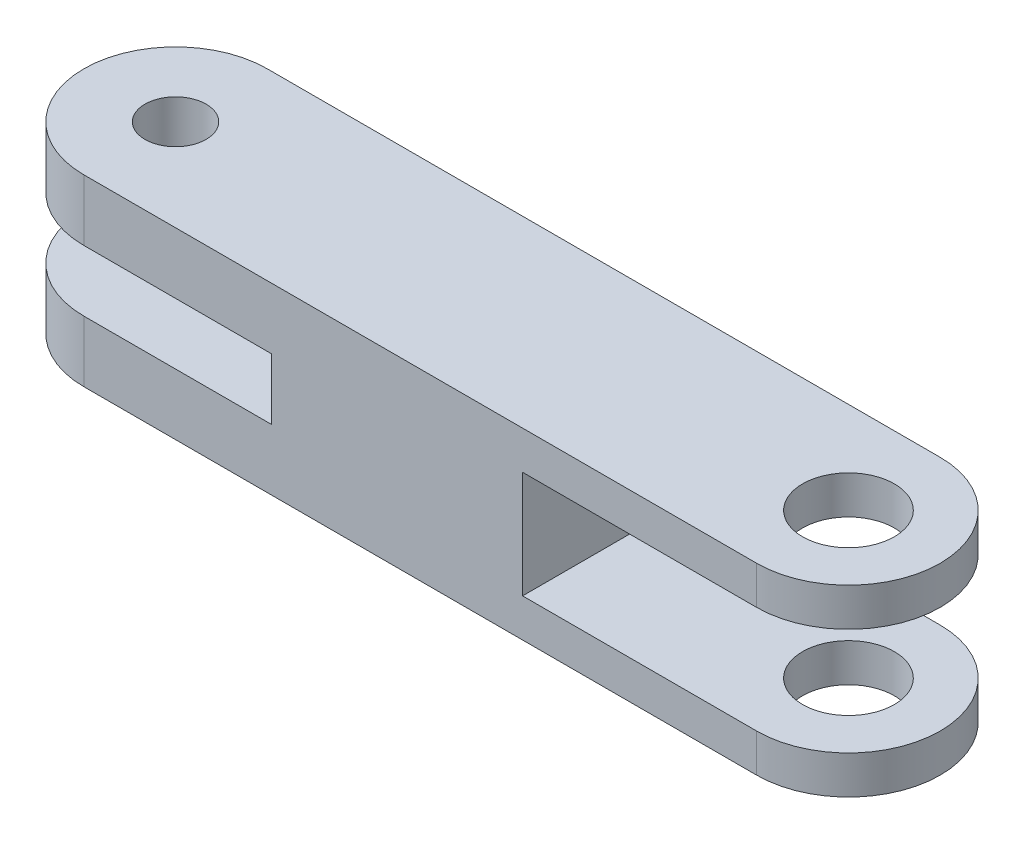
ISO-10303-21;
HEADER;
FILE_DESCRIPTION(('STEP AP214'),'2;1');
FILE_NAME('part.step','',(''),(''),'','','');
FILE_SCHEMA(('AUTOMOTIVE_DESIGN { 1 0 10303 214 1 1 1 1 }'));
ENDSEC;
DATA;
#1=APPLICATION_CONTEXT('core data for automotive mechanical design processes');
#2=APPLICATION_PROTOCOL_DEFINITION('international standard','automotive_design',2000,#1);
#3=PRODUCT_CONTEXT('',#1,'mechanical');
#4=PRODUCT('Part','Part','',(#3));
#5=PRODUCT_RELATED_PRODUCT_CATEGORY('part','',(#4));
#6=PRODUCT_DEFINITION_FORMATION('','',#4);
#7=PRODUCT_DEFINITION_CONTEXT('part definition',#1,'design');
#8=PRODUCT_DEFINITION('design','',#6,#7);
#9=PRODUCT_DEFINITION_SHAPE('','',#8);
#10=(LENGTH_UNIT() NAMED_UNIT(*) SI_UNIT(.MILLI.,.METRE.));
#11=(NAMED_UNIT(*) PLANE_ANGLE_UNIT() SI_UNIT($,.RADIAN.));
#12=(NAMED_UNIT(*) SI_UNIT($,.STERADIAN.) SOLID_ANGLE_UNIT());
#13=UNCERTAINTY_MEASURE_WITH_UNIT(LENGTH_MEASURE(1.E-05),#10,'distance_accuracy_value','');
#14=(GEOMETRIC_REPRESENTATION_CONTEXT(3) GLOBAL_UNCERTAINTY_ASSIGNED_CONTEXT((#13)) GLOBAL_UNIT_ASSIGNED_CONTEXT((#10,
#11,#12)) REPRESENTATION_CONTEXT('',''));
#15=CARTESIAN_POINT('',(0.,0.,0.));
#16=DIRECTION('',(0.,0.,1.));
#17=DIRECTION('',(1.,0.,0.));
#18=AXIS2_PLACEMENT_3D('',#15,#16,#17);
#19=CARTESIAN_POINT('',(0.,3.,0.));
#20=DIRECTION('',(0.,-1.,0.));
#21=DIRECTION('',(0.,0.,-1.));
#22=AXIS2_PLACEMENT_3D('',#19,#20,#21);
#23=CYLINDRICAL_SURFACE('',#22,3.);
#24=CARTESIAN_POINT('',(0.,1.,0.));
#25=DIRECTION('',(0.,-1.,0.));
#26=DIRECTION('',(0.,0.,-1.));
#27=AXIS2_PLACEMENT_3D('',#24,#25,#26);
#28=CIRCLE('',#27,3.);
#29=CARTESIAN_POINT('',(0.,1.,3.));
#30=VERTEX_POINT('',#29);
#31=CARTESIAN_POINT('',(0.,1.,-3.));
#32=VERTEX_POINT('',#31);
#33=EDGE_CURVE('E153',#30,#32,#28,.T.);
#34=ORIENTED_EDGE('',*,*,#33,.F.);
#35=DIRECTION('',(0.,-1.,0.));
#36=VECTOR('',#35,1.);
#37=CARTESIAN_POINT('',(0.,3.,3.));
#38=LINE('',#37,#36);
#39=CARTESIAN_POINT('',(0.,3.,3.));
#40=VERTEX_POINT('',#39);
#41=EDGE_CURVE('E148',#40,#30,#38,.T.);
#42=ORIENTED_EDGE('',*,*,#41,.F.);
#43=CARTESIAN_POINT('',(0.,3.,0.));
#44=DIRECTION('',(0.,1.,0.));
#45=DIRECTION('',(0.,0.,1.));
#46=AXIS2_PLACEMENT_3D('',#43,#44,#45);
#47=CIRCLE('',#46,3.);
#48=CARTESIAN_POINT('',(0.,3.,-3.));
#49=VERTEX_POINT('',#48);
#50=EDGE_CURVE('E200',#49,#40,#47,.T.);
#51=ORIENTED_EDGE('',*,*,#50,.F.);
#52=DIRECTION('',(0.,-1.,0.));
#53=VECTOR('',#52,1.);
#54=CARTESIAN_POINT('',(0.,3.,-3.));
#55=LINE('',#54,#53);
#56=EDGE_CURVE('E221',#49,#32,#55,.T.);
#57=ORIENTED_EDGE('',*,*,#56,.T.);
#58=EDGE_LOOP('',(#34,#42,#51,#57));
#59=FACE_BOUND('',#58,.T.);
#60=ADVANCED_FACE('F41',(#59),#23,.T.);
#61=CARTESIAN_POINT('',(0.,3.,0.));
#62=DIRECTION('',(0.,-1.,0.));
#63=DIRECTION('',(0.,0.,-1.));
#64=AXIS2_PLACEMENT_3D('',#61,#62,#63);
#65=CYLINDRICAL_SURFACE('',#64,1.);
#66=CARTESIAN_POINT('',(0.,3.,0.));
#67=DIRECTION('',(0.,1.,0.));
#68=DIRECTION('',(0.,0.,1.));
#69=AXIS2_PLACEMENT_3D('',#66,#67,#68);
#70=CIRCLE('',#69,1.);
#71=CARTESIAN_POINT('',(0.,3.,1.));
#72=VERTEX_POINT('',#71);
#73=EDGE_CURVE('E188',#72,#72,#70,.T.);
#74=ORIENTED_EDGE('',*,*,#73,.T.);
#75=EDGE_LOOP('',(#74));
#76=FACE_BOUND('',#75,.T.);
#77=CARTESIAN_POINT('',(0.,1.,0.));
#78=DIRECTION('',(0.,-1.,0.));
#79=DIRECTION('',(0.,0.,-1.));
#80=AXIS2_PLACEMENT_3D('',#77,#78,#79);
#81=CIRCLE('',#80,1.);
#82=CARTESIAN_POINT('',(0.,1.,-1.));
#83=VERTEX_POINT('',#82);
#84=EDGE_CURVE('E240',#83,#83,#81,.T.);
#85=ORIENTED_EDGE('',*,*,#84,.T.);
#86=EDGE_LOOP('',(#85));
#87=FACE_BOUND('',#86,.T.);
#88=ADVANCED_FACE('F285',(#76,#87),#65,.F.);
#89=CARTESIAN_POINT('',(0.,3.,3.));
#90=DIRECTION('',(0.,0.,-1.));
#91=DIRECTION('',(-1.,0.,0.));
#92=AXIS2_PLACEMENT_3D('',#89,#90,#91);
#93=PLANE('',#92);
#94=DIRECTION('',(0.,-1.,0.));
#95=VECTOR('',#94,1.);
#96=CARTESIAN_POINT('',(6.13903412950462,3.,3.));
#97=LINE('',#96,#95);
#98=CARTESIAN_POINT('',(6.13903412950462,1.,3.));
#99=VERTEX_POINT('',#98);
#100=CARTESIAN_POINT('',(6.13903412950462,-1.,3.));
#101=VERTEX_POINT('',#100);
#102=EDGE_CURVE('E132',#99,#101,#97,.T.);
#103=ORIENTED_EDGE('',*,*,#102,.T.);
#104=DIRECTION('',(-1.,0.,0.));
#105=VECTOR('',#104,1.);
#106=CARTESIAN_POINT('',(0.,-1.,3.));
#107=LINE('',#106,#105);
#108=CARTESIAN_POINT('',(0.,-1.,3.));
#109=VERTEX_POINT('',#108);
#110=EDGE_CURVE('E139',#101,#109,#107,.T.);
#111=ORIENTED_EDGE('',*,*,#110,.T.);
#112=CARTESIAN_POINT('',(0.,-3.,3.));
#113=VERTEX_POINT('',#112);
#114=EDGE_CURVE('E232',#109,#113,#38,.T.);
#115=ORIENTED_EDGE('',*,*,#114,.T.);
#116=DIRECTION('',(1.,0.,0.));
#117=VECTOR('',#116,1.);
#118=CARTESIAN_POINT('',(0.,-3.,3.));
#119=LINE('',#118,#117);
#120=CARTESIAN_POINT('',(22.,-3.,3.));
#121=VERTEX_POINT('',#120);
#122=EDGE_CURVE('E213',#113,#121,#119,.T.);
#123=ORIENTED_EDGE('',*,*,#122,.T.);
#124=DIRECTION('',(0.,-1.,0.));
#125=VECTOR('',#124,1.);
#126=CARTESIAN_POINT('',(22.,3.,3.));
#127=LINE('',#126,#125);
#128=CARTESIAN_POINT('',(22.,-1.75,3.));
#129=VERTEX_POINT('',#128);
#130=EDGE_CURVE('E228',#129,#121,#127,.T.);
#131=ORIENTED_EDGE('',*,*,#130,.F.);
#132=DIRECTION('',(1.,0.,0.));
#133=VECTOR('',#132,1.);
#134=CARTESIAN_POINT('',(0.,-1.75,3.));
#135=LINE('',#134,#133);
#136=CARTESIAN_POINT('',(14.3461409194115,-1.75,3.));
#137=VERTEX_POINT('',#136);
#138=EDGE_CURVE('E182',#137,#129,#135,.T.);
#139=ORIENTED_EDGE('',*,*,#138,.F.);
#140=DIRECTION('',(0.,1.,0.));
#141=VECTOR('',#140,1.);
#142=CARTESIAN_POINT('',(14.3461409194115,3.,3.));
#143=LINE('',#142,#141);
#144=CARTESIAN_POINT('',(14.3461409194115,1.75,3.));
#145=VERTEX_POINT('',#144);
#146=EDGE_CURVE('E184',#137,#145,#143,.T.);
#147=ORIENTED_EDGE('',*,*,#146,.T.);
#148=DIRECTION('',(1.,0.,0.));
#149=VECTOR('',#148,1.);
#150=CARTESIAN_POINT('',(0.,1.75,3.));
#151=LINE('',#150,#149);
#152=CARTESIAN_POINT('',(22.,1.75,3.));
#153=VERTEX_POINT('',#152);
#154=EDGE_CURVE('E174',#145,#153,#151,.T.);
#155=ORIENTED_EDGE('',*,*,#154,.T.);
#156=CARTESIAN_POINT('',(22.,3.,3.));
#157=VERTEX_POINT('',#156);
#158=EDGE_CURVE('E229',#157,#153,#127,.T.);
#159=ORIENTED_EDGE('',*,*,#158,.F.);
#160=DIRECTION('',(1.,0.,0.));
#161=VECTOR('',#160,1.);
#162=CARTESIAN_POINT('',(0.,3.,3.));
#163=LINE('',#162,#161);
#164=EDGE_CURVE('E203',#40,#157,#163,.T.);
#165=ORIENTED_EDGE('',*,*,#164,.F.);
#166=ORIENTED_EDGE('',*,*,#41,.T.);
#167=DIRECTION('',(-1.,0.,0.));
#168=VECTOR('',#167,1.);
#169=CARTESIAN_POINT('',(0.,1.,3.));
#170=LINE('',#169,#168);
#171=EDGE_CURVE('E56',#99,#30,#170,.T.);
#172=ORIENTED_EDGE('',*,*,#171,.F.);
#173=EDGE_LOOP('',(#103,#111,#115,#123,#131,#139,#147,#155,#159,#165,#166,#172));
#174=FACE_BOUND('',#173,.T.);
#175=ADVANCED_FACE('F146',(#174),#93,.F.);
#176=CARTESIAN_POINT('',(22.,3.,0.));
#177=DIRECTION('',(0.,-1.,0.));
#178=DIRECTION('',(0.,0.,-1.));
#179=AXIS2_PLACEMENT_3D('',#176,#177,#178);
#180=CYLINDRICAL_SURFACE('',#179,3.);
#181=CARTESIAN_POINT('',(22.,-1.75,0.));
#182=DIRECTION('',(0.,1.,0.));
#183=DIRECTION('',(0.,0.,1.));
#184=AXIS2_PLACEMENT_3D('',#181,#182,#183);
#185=CIRCLE('',#184,3.);
#186=CARTESIAN_POINT('',(22.,-1.75,-3.));
#187=VERTEX_POINT('',#186);
#188=EDGE_CURVE('E180',#129,#187,#185,.T.);
#189=ORIENTED_EDGE('',*,*,#188,.F.);
#190=ORIENTED_EDGE('',*,*,#130,.T.);
#191=CARTESIAN_POINT('',(22.,-3.,0.));
#192=DIRECTION('',(0.,1.,0.));
#193=DIRECTION('',(0.,0.,1.));
#194=AXIS2_PLACEMENT_3D('',#191,#192,#193);
#195=CIRCLE('',#194,3.);
#196=CARTESIAN_POINT('',(22.,-3.,-3.));
#197=VERTEX_POINT('',#196);
#198=EDGE_CURVE('E216',#121,#197,#195,.T.);
#199=ORIENTED_EDGE('',*,*,#198,.T.);
#200=DIRECTION('',(0.,-1.,0.));
#201=VECTOR('',#200,1.);
#202=CARTESIAN_POINT('',(22.,3.,-3.));
#203=LINE('',#202,#201);
#204=EDGE_CURVE('E224',#187,#197,#203,.T.);
#205=ORIENTED_EDGE('',*,*,#204,.F.);
#206=EDGE_LOOP('',(#189,#190,#199,#205));
#207=FACE_BOUND('',#206,.T.);
#208=ADVANCED_FACE('F263',(#207),#180,.T.);
#209=CARTESIAN_POINT('',(0.,3.,-3.));
#210=DIRECTION('',(0.,0.,1.));
#211=DIRECTION('',(1.,0.,0.));
#212=AXIS2_PLACEMENT_3D('',#209,#210,#211);
#213=PLANE('',#212);
#214=CARTESIAN_POINT('',(0.,-1.,-3.));
#215=VERTEX_POINT('',#214);
#216=CARTESIAN_POINT('',(0.,-3.,-3.));
#217=VERTEX_POINT('',#216);
#218=EDGE_CURVE('E210',#215,#217,#55,.T.);
#219=ORIENTED_EDGE('',*,*,#218,.F.);
#220=DIRECTION('',(1.,0.,0.));
#221=VECTOR('',#220,1.);
#222=CARTESIAN_POINT('',(0.,-1.,-3.));
#223=LINE('',#222,#221);
#224=CARTESIAN_POINT('',(6.13903412950462,-1.,-3.));
#225=VERTEX_POINT('',#224);
#226=EDGE_CURVE('E159',#215,#225,#223,.T.);
#227=ORIENTED_EDGE('',*,*,#226,.T.);
#228=DIRECTION('',(0.,1.,0.));
#229=VECTOR('',#228,1.);
#230=CARTESIAN_POINT('',(6.13903412950462,3.,-3.));
#231=LINE('',#230,#229);
#232=CARTESIAN_POINT('',(6.13903412950462,1.,-3.));
#233=VERTEX_POINT('',#232);
#234=EDGE_CURVE('E11',#225,#233,#231,.T.);
#235=ORIENTED_EDGE('',*,*,#234,.T.);
#236=DIRECTION('',(1.,0.,0.));
#237=VECTOR('',#236,1.);
#238=CARTESIAN_POINT('',(0.,1.,-3.));
#239=LINE('',#238,#237);
#240=EDGE_CURVE('E143',#32,#233,#239,.T.);
#241=ORIENTED_EDGE('',*,*,#240,.F.);
#242=ORIENTED_EDGE('',*,*,#56,.F.);
#243=DIRECTION('',(-1.,0.,0.));
#244=VECTOR('',#243,1.);
#245=CARTESIAN_POINT('',(0.,3.,-3.));
#246=LINE('',#245,#244);
#247=CARTESIAN_POINT('',(22.,3.,-3.));
#248=VERTEX_POINT('',#247);
#249=EDGE_CURVE('E208',#248,#49,#246,.T.);
#250=ORIENTED_EDGE('',*,*,#249,.F.);
#251=CARTESIAN_POINT('',(22.,1.75,-3.));
#252=VERTEX_POINT('',#251);
#253=EDGE_CURVE('E225',#248,#252,#203,.T.);
#254=ORIENTED_EDGE('',*,*,#253,.T.);
#255=DIRECTION('',(-1.,0.,0.));
#256=VECTOR('',#255,1.);
#257=CARTESIAN_POINT('',(0.,1.75,-3.));
#258=LINE('',#257,#256);
#259=CARTESIAN_POINT('',(14.3461409194115,1.75,-3.));
#260=VERTEX_POINT('',#259);
#261=EDGE_CURVE('E168',#252,#260,#258,.T.);
#262=ORIENTED_EDGE('',*,*,#261,.T.);
#263=DIRECTION('',(0.,-1.,0.));
#264=VECTOR('',#263,1.);
#265=CARTESIAN_POINT('',(14.3461409194115,3.,-3.));
#266=LINE('',#265,#264);
#267=CARTESIAN_POINT('',(14.3461409194115,-1.75,-3.));
#268=VERTEX_POINT('',#267);
#269=EDGE_CURVE('E49',#260,#268,#266,.T.);
#270=ORIENTED_EDGE('',*,*,#269,.T.);
#271=DIRECTION('',(-1.,0.,0.));
#272=VECTOR('',#271,1.);
#273=CARTESIAN_POINT('',(0.,-1.75,-3.));
#274=LINE('',#273,#272);
#275=EDGE_CURVE('E178',#187,#268,#274,.T.);
#276=ORIENTED_EDGE('',*,*,#275,.F.);
#277=ORIENTED_EDGE('',*,*,#204,.T.);
#278=DIRECTION('',(-1.,0.,0.));
#279=VECTOR('',#278,1.);
#280=CARTESIAN_POINT('',(0.,-3.,-3.));
#281=LINE('',#280,#279);
#282=EDGE_CURVE('E204',#197,#217,#281,.T.);
#283=ORIENTED_EDGE('',*,*,#282,.T.);
#284=EDGE_LOOP('',(#219,#227,#235,#241,#242,#250,#254,#262,#270,#276,#277,#283));
#285=FACE_BOUND('',#284,.T.);
#286=ADVANCED_FACE('F249',(#285),#213,.F.);
#287=CARTESIAN_POINT('',(22.,3.,0.));
#288=DIRECTION('',(0.,-1.,0.));
#289=DIRECTION('',(0.,0.,-1.));
#290=AXIS2_PLACEMENT_3D('',#287,#288,#289);
#291=CYLINDRICAL_SURFACE('',#290,1.5);
#292=CARTESIAN_POINT('',(22.,-3.,0.));
#293=DIRECTION('',(0.,1.,0.));
#294=DIRECTION('',(0.,0.,1.));
#295=AXIS2_PLACEMENT_3D('',#292,#293,#294);
#296=CIRCLE('',#295,1.5);
#297=CARTESIAN_POINT('',(22.,-3.,1.5));
#298=VERTEX_POINT('',#297);
#299=EDGE_CURVE('E191',#298,#298,#296,.T.);
#300=ORIENTED_EDGE('',*,*,#299,.F.);
#301=EDGE_LOOP('',(#300));
#302=FACE_BOUND('',#301,.T.);
#303=CARTESIAN_POINT('',(22.,-1.75,0.));
#304=DIRECTION('',(0.,1.,0.));
#305=DIRECTION('',(0.,0.,1.));
#306=AXIS2_PLACEMENT_3D('',#303,#304,#305);
#307=CIRCLE('',#306,1.5);
#308=CARTESIAN_POINT('',(22.,-1.75,1.5));
#309=VERTEX_POINT('',#308);
#310=EDGE_CURVE('E177',#309,#309,#307,.T.);
#311=ORIENTED_EDGE('',*,*,#310,.T.);
#312=EDGE_LOOP('',(#311));
#313=FACE_BOUND('',#312,.T.);
#314=ADVANCED_FACE('F307',(#302,#313),#291,.F.);
#315=CARTESIAN_POINT('',(0.,3.,0.));
#316=DIRECTION('',(0.,1.,0.));
#317=DIRECTION('',(0.,0.,1.));
#318=AXIS2_PLACEMENT_3D('',#315,#316,#317);
#319=PLANE('',#318);
#320=CARTESIAN_POINT('',(22.,3.,0.));
#321=DIRECTION('',(0.,1.,0.));
#322=DIRECTION('',(0.,0.,1.));
#323=AXIS2_PLACEMENT_3D('',#320,#321,#322);
#324=CIRCLE('',#323,1.5);
#325=CARTESIAN_POINT('',(22.,3.,1.5));
#326=VERTEX_POINT('',#325);
#327=EDGE_CURVE('E194',#326,#326,#324,.T.);
#328=ORIENTED_EDGE('',*,*,#327,.F.);
#329=EDGE_LOOP('',(#328));
#330=FACE_BOUND('',#329,.T.);
#331=ORIENTED_EDGE('',*,*,#50,.T.);
#332=ORIENTED_EDGE('',*,*,#164,.T.);
#333=CARTESIAN_POINT('',(22.,3.,0.));
#334=DIRECTION('',(0.,1.,0.));
#335=DIRECTION('',(0.,0.,1.));
#336=AXIS2_PLACEMENT_3D('',#333,#334,#335);
#337=CIRCLE('',#336,3.);
#338=EDGE_CURVE('E206',#157,#248,#337,.T.);
#339=ORIENTED_EDGE('',*,*,#338,.T.);
#340=ORIENTED_EDGE('',*,*,#249,.T.);
#341=EDGE_LOOP('',(#331,#332,#339,#340));
#342=FACE_BOUND('',#341,.T.);
#343=ORIENTED_EDGE('',*,*,#73,.F.);
#344=EDGE_LOOP('',(#343));
#345=FACE_BOUND('',#344,.T.);
#346=ADVANCED_FACE('F280',(#330,#342,#345),#319,.T.);
#347=CARTESIAN_POINT('',(0.,-3.,0.));
#348=DIRECTION('',(0.,1.,0.));
#349=DIRECTION('',(0.,0.,1.));
#350=AXIS2_PLACEMENT_3D('',#347,#348,#349);
#351=PLANE('',#350);
#352=CARTESIAN_POINT('',(0.,-3.,0.));
#353=DIRECTION('',(0.,1.,0.));
#354=DIRECTION('',(0.,0.,1.));
#355=AXIS2_PLACEMENT_3D('',#352,#353,#354);
#356=CIRCLE('',#355,3.);
#357=EDGE_CURVE('E197',#217,#113,#356,.T.);
#358=ORIENTED_EDGE('',*,*,#357,.F.);
#359=ORIENTED_EDGE('',*,*,#282,.F.);
#360=ORIENTED_EDGE('',*,*,#198,.F.);
#361=ORIENTED_EDGE('',*,*,#122,.F.);
#362=EDGE_LOOP('',(#358,#359,#360,#361));
#363=FACE_BOUND('',#362,.T.);
#364=ORIENTED_EDGE('',*,*,#299,.T.);
#365=EDGE_LOOP('',(#364));
#366=FACE_BOUND('',#365,.T.);
#367=CARTESIAN_POINT('',(0.,-3.,0.));
#368=DIRECTION('',(0.,1.,0.));
#369=DIRECTION('',(0.,0.,1.));
#370=AXIS2_PLACEMENT_3D('',#367,#368,#369);
#371=CIRCLE('',#370,1.);
#372=CARTESIAN_POINT('',(0.,-3.,1.));
#373=VERTEX_POINT('',#372);
#374=EDGE_CURVE('E187',#373,#373,#371,.T.);
#375=ORIENTED_EDGE('',*,*,#374,.T.);
#376=EDGE_LOOP('',(#375));
#377=FACE_BOUND('',#376,.T.);
#378=ADVANCED_FACE('F258',(#363,#366,#377),#351,.F.);
#379=ORIENTED_EDGE('',*,*,#114,.F.);
#380=CARTESIAN_POINT('',(0.,-1.,0.));
#381=DIRECTION('',(0.,-1.,0.));
#382=DIRECTION('',(0.,0.,-1.));
#383=AXIS2_PLACEMENT_3D('',#380,#381,#382);
#384=CIRCLE('',#383,3.);
#385=EDGE_CURVE('E152',#109,#215,#384,.T.);
#386=ORIENTED_EDGE('',*,*,#385,.T.);
#387=ORIENTED_EDGE('',*,*,#218,.T.);
#388=ORIENTED_EDGE('',*,*,#357,.T.);
#389=EDGE_LOOP('',(#379,#386,#387,#388));
#390=FACE_BOUND('',#389,.T.);
#391=ADVANCED_FACE('F43',(#390),#23,.T.);
#392=ORIENTED_EDGE('',*,*,#158,.T.);
#393=CARTESIAN_POINT('',(22.,1.75,0.));
#394=DIRECTION('',(0.,1.,0.));
#395=DIRECTION('',(0.,0.,1.));
#396=AXIS2_PLACEMENT_3D('',#393,#394,#395);
#397=CIRCLE('',#396,3.);
#398=EDGE_CURVE('E171',#153,#252,#397,.T.);
#399=ORIENTED_EDGE('',*,*,#398,.T.);
#400=ORIENTED_EDGE('',*,*,#253,.F.);
#401=ORIENTED_EDGE('',*,*,#338,.F.);
#402=EDGE_LOOP('',(#392,#399,#400,#401));
#403=FACE_BOUND('',#402,.T.);
#404=ADVANCED_FACE('F275',(#403),#180,.T.);
#405=CARTESIAN_POINT('',(22.,1.75,0.));
#406=DIRECTION('',(0.,1.,0.));
#407=DIRECTION('',(0.,0.,1.));
#408=AXIS2_PLACEMENT_3D('',#405,#406,#407);
#409=CIRCLE('',#408,1.5);
#410=CARTESIAN_POINT('',(22.,1.75,1.5));
#411=VERTEX_POINT('',#410);
#412=EDGE_CURVE('E166',#411,#411,#409,.T.);
#413=ORIENTED_EDGE('',*,*,#412,.F.);
#414=EDGE_LOOP('',(#413));
#415=FACE_BOUND('',#414,.T.);
#416=ORIENTED_EDGE('',*,*,#327,.T.);
#417=EDGE_LOOP('',(#416));
#418=FACE_BOUND('',#417,.T.);
#419=ADVANCED_FACE('F299',(#415,#418),#291,.F.);
#420=CARTESIAN_POINT('',(0.,-1.,0.));
#421=DIRECTION('',(0.,-1.,0.));
#422=DIRECTION('',(0.,0.,-1.));
#423=AXIS2_PLACEMENT_3D('',#420,#421,#422);
#424=CIRCLE('',#423,1.);
#425=CARTESIAN_POINT('',(0.,-1.,-1.));
#426=VERTEX_POINT('',#425);
#427=EDGE_CURVE('E149',#426,#426,#424,.T.);
#428=ORIENTED_EDGE('',*,*,#427,.F.);
#429=EDGE_LOOP('',(#428));
#430=FACE_BOUND('',#429,.T.);
#431=ORIENTED_EDGE('',*,*,#374,.F.);
#432=EDGE_LOOP('',(#431));
#433=FACE_BOUND('',#432,.T.);
#434=ADVANCED_FACE('F292',(#430,#433),#65,.F.);
#435=CARTESIAN_POINT('',(14.3461409194115,-1.75,-7.84320747138726));
#436=DIRECTION('',(-1.,0.,0.));
#437=DIRECTION('',(0.,0.,1.));
#438=AXIS2_PLACEMENT_3D('',#435,#436,#437);
#439=PLANE('',#438);
#440=DIRECTION('',(0.,0.,1.));
#441=VECTOR('',#440,1.);
#442=CARTESIAN_POINT('',(14.3461409194115,-1.75,-7.84320747138726));
#443=LINE('',#442,#441);
#444=EDGE_CURVE('E163',#268,#137,#443,.T.);
#445=ORIENTED_EDGE('',*,*,#444,.F.);
#446=ORIENTED_EDGE('',*,*,#269,.F.);
#447=DIRECTION('',(0.,0.,1.));
#448=VECTOR('',#447,1.);
#449=CARTESIAN_POINT('',(14.3461409194115,1.75,-7.84320747138726));
#450=LINE('',#449,#448);
#451=EDGE_CURVE('E64',#260,#145,#450,.T.);
#452=ORIENTED_EDGE('',*,*,#451,.T.);
#453=ORIENTED_EDGE('',*,*,#146,.F.);
#454=EDGE_LOOP('',(#445,#446,#452,#453));
#455=FACE_BOUND('',#454,.T.);
#456=ADVANCED_FACE('F270',(#455),#439,.F.);
#457=CARTESIAN_POINT('',(0.,-1.75,0.));
#458=DIRECTION('',(0.,1.,0.));
#459=DIRECTION('',(0.,0.,1.));
#460=AXIS2_PLACEMENT_3D('',#457,#458,#459);
#461=PLANE('',#460);
#462=ORIENTED_EDGE('',*,*,#310,.F.);
#463=EDGE_LOOP('',(#462));
#464=FACE_BOUND('',#463,.T.);
#465=ORIENTED_EDGE('',*,*,#138,.T.);
#466=ORIENTED_EDGE('',*,*,#188,.T.);
#467=ORIENTED_EDGE('',*,*,#275,.T.);
#468=ORIENTED_EDGE('',*,*,#444,.T.);
#469=EDGE_LOOP('',(#465,#466,#467,#468));
#470=FACE_BOUND('',#469,.T.);
#471=ADVANCED_FACE('F266',(#464,#470),#461,.T.);
#472=CARTESIAN_POINT('',(0.,1.75,0.));
#473=DIRECTION('',(0.,1.,0.));
#474=DIRECTION('',(0.,0.,1.));
#475=AXIS2_PLACEMENT_3D('',#472,#473,#474);
#476=PLANE('',#475);
#477=ORIENTED_EDGE('',*,*,#412,.T.);
#478=EDGE_LOOP('',(#477));
#479=FACE_BOUND('',#478,.T.);
#480=ORIENTED_EDGE('',*,*,#451,.F.);
#481=ORIENTED_EDGE('',*,*,#261,.F.);
#482=ORIENTED_EDGE('',*,*,#398,.F.);
#483=ORIENTED_EDGE('',*,*,#154,.F.);
#484=EDGE_LOOP('',(#480,#481,#482,#483));
#485=FACE_BOUND('',#484,.T.);
#486=ADVANCED_FACE('F273',(#479,#485),#476,.F.);
#487=CARTESIAN_POINT('',(6.13903412950462,-1.,-5.03584344586886));
#488=DIRECTION('',(1.,0.,0.));
#489=DIRECTION('',(0.,0.,-1.));
#490=AXIS2_PLACEMENT_3D('',#487,#488,#489);
#491=PLANE('',#490);
#492=DIRECTION('',(0.,0.,-1.));
#493=VECTOR('',#492,1.);
#494=CARTESIAN_POINT('',(6.13903412950462,1.,-5.03584344586886));
#495=LINE('',#494,#493);
#496=EDGE_CURVE('E134',#99,#233,#495,.T.);
#497=ORIENTED_EDGE('',*,*,#496,.T.);
#498=ORIENTED_EDGE('',*,*,#234,.F.);
#499=DIRECTION('',(0.,0.,-1.));
#500=VECTOR('',#499,1.);
#501=CARTESIAN_POINT('',(6.13903412950462,-1.,-5.03584344586886));
#502=LINE('',#501,#500);
#503=EDGE_CURVE('E136',#101,#225,#502,.T.);
#504=ORIENTED_EDGE('',*,*,#503,.F.);
#505=ORIENTED_EDGE('',*,*,#102,.F.);
#506=EDGE_LOOP('',(#497,#498,#504,#505));
#507=FACE_BOUND('',#506,.T.);
#508=ADVANCED_FACE('F133',(#507),#491,.F.);
#509=CARTESIAN_POINT('',(0.,-1.,0.));
#510=DIRECTION('',(0.,-1.,0.));
#511=DIRECTION('',(0.,0.,-1.));
#512=AXIS2_PLACEMENT_3D('',#509,#510,#511);
#513=PLANE('',#512);
#514=ORIENTED_EDGE('',*,*,#427,.T.);
#515=EDGE_LOOP('',(#514));
#516=FACE_BOUND('',#515,.T.);
#517=ORIENTED_EDGE('',*,*,#503,.T.);
#518=ORIENTED_EDGE('',*,*,#226,.F.);
#519=ORIENTED_EDGE('',*,*,#385,.F.);
#520=ORIENTED_EDGE('',*,*,#110,.F.);
#521=EDGE_LOOP('',(#517,#518,#519,#520));
#522=FACE_BOUND('',#521,.T.);
#523=ADVANCED_FACE('F246',(#516,#522),#513,.F.);
#524=CARTESIAN_POINT('',(0.,1.,0.));
#525=DIRECTION('',(0.,-1.,0.));
#526=DIRECTION('',(0.,0.,-1.));
#527=AXIS2_PLACEMENT_3D('',#524,#525,#526);
#528=PLANE('',#527);
#529=ORIENTED_EDGE('',*,*,#84,.F.);
#530=EDGE_LOOP('',(#529));
#531=FACE_BOUND('',#530,.T.);
#532=ORIENTED_EDGE('',*,*,#171,.T.);
#533=ORIENTED_EDGE('',*,*,#33,.T.);
#534=ORIENTED_EDGE('',*,*,#240,.T.);
#535=ORIENTED_EDGE('',*,*,#496,.F.);
#536=EDGE_LOOP('',(#532,#533,#534,#535));
#537=FACE_BOUND('',#536,.T.);
#538=ADVANCED_FACE('F141',(#531,#537),#528,.T.);
#539=CLOSED_SHELL('',(#60,#88,#175,#208,#286,#314,#346,#378,#391,#404,#419,#434,#456,#471,#486,
#508,#523,#538));
#540=MANIFOLD_SOLID_BREP('B2',#539);
#541=ADVANCED_BREP_SHAPE_REPRESENTATION('',(#18,#540),#14);
#542=SHAPE_DEFINITION_REPRESENTATION(#9,#541);
ENDSEC;
END-ISO-10303-21;
